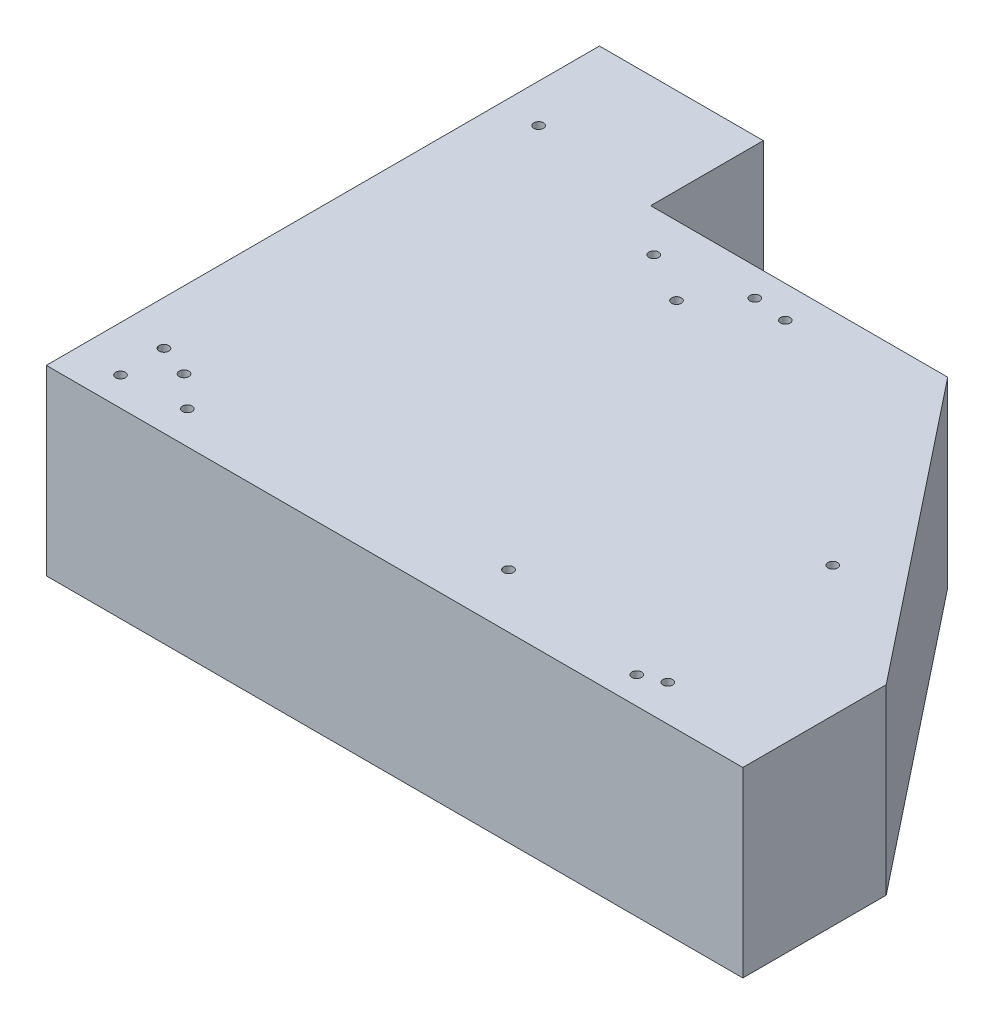
ISO-10303-21;
HEADER;
FILE_DESCRIPTION(('STEP AP214'),'2;1');
FILE_NAME('part.step','',(''),(''),'','','');
FILE_SCHEMA(('AUTOMOTIVE_DESIGN { 1 0 10303 214 1 1 1 1 }'));
ENDSEC;
DATA;
#1=APPLICATION_CONTEXT('core data for automotive mechanical design processes');
#2=APPLICATION_PROTOCOL_DEFINITION('international standard','automotive_design',2000,#1);
#3=PRODUCT_CONTEXT('',#1,'mechanical');
#4=PRODUCT('Part','Part','',(#3));
#5=PRODUCT_RELATED_PRODUCT_CATEGORY('part','',(#4));
#6=PRODUCT_DEFINITION_FORMATION('','',#4);
#7=PRODUCT_DEFINITION_CONTEXT('part definition',#1,'design');
#8=PRODUCT_DEFINITION('design','',#6,#7);
#9=PRODUCT_DEFINITION_SHAPE('','',#8);
#10=(LENGTH_UNIT() NAMED_UNIT(*) SI_UNIT(.MILLI.,.METRE.));
#11=(NAMED_UNIT(*) PLANE_ANGLE_UNIT() SI_UNIT($,.RADIAN.));
#12=(NAMED_UNIT(*) SI_UNIT($,.STERADIAN.) SOLID_ANGLE_UNIT());
#13=UNCERTAINTY_MEASURE_WITH_UNIT(LENGTH_MEASURE(1.E-05),#10,'distance_accuracy_value','');
#14=(GEOMETRIC_REPRESENTATION_CONTEXT(3) GLOBAL_UNCERTAINTY_ASSIGNED_CONTEXT((#13)) GLOBAL_UNIT_ASSIGNED_CONTEXT((#10,
#11,#12)) REPRESENTATION_CONTEXT('',''));
#15=CARTESIAN_POINT('',(0.,0.,0.));
#16=DIRECTION('',(0.,0.,1.));
#17=DIRECTION('',(1.,0.,0.));
#18=AXIS2_PLACEMENT_3D('',#15,#16,#17);
#19=CARTESIAN_POINT('',(244.3,113.03,135.64242453302));
#20=DIRECTION('',(-1.,0.,0.));
#21=DIRECTION('',(0.,0.,1.));
#22=AXIS2_PLACEMENT_3D('',#19,#20,#21);
#23=PLANE('',#22);
#24=DIRECTION('',(0.,0.,-1.));
#25=VECTOR('',#24,1.);
#26=CARTESIAN_POINT('',(244.3,0.,135.64242453302));
#27=LINE('',#26,#25);
#28=CARTESIAN_POINT('',(244.3,0.,135.64242453302));
#29=VERTEX_POINT('',#28);
#30=CARTESIAN_POINT('',(244.3,0.,46.7424245330204));
#31=VERTEX_POINT('',#30);
#32=EDGE_CURVE('E123',#29,#31,#27,.T.);
#33=ORIENTED_EDGE('',*,*,#32,.T.);
#34=DIRECTION('',(0.,-1.,0.));
#35=VECTOR('',#34,1.);
#36=CARTESIAN_POINT('',(244.3,113.03,46.7424245330204));
#37=LINE('',#36,#35);
#38=CARTESIAN_POINT('',(244.3,113.03,46.7424245330204));
#39=VERTEX_POINT('',#38);
#40=EDGE_CURVE('E11',#39,#31,#37,.T.);
#41=ORIENTED_EDGE('',*,*,#40,.F.);
#42=DIRECTION('',(0.,0.,-1.));
#43=VECTOR('',#42,1.);
#44=CARTESIAN_POINT('',(244.3,113.03,135.64242453302));
#45=LINE('',#44,#43);
#46=CARTESIAN_POINT('',(244.3,113.03,135.64242453302));
#47=VERTEX_POINT('',#46);
#48=EDGE_CURVE('E136',#47,#39,#45,.T.);
#49=ORIENTED_EDGE('',*,*,#48,.F.);
#50=DIRECTION('',(0.,-1.,0.));
#51=VECTOR('',#50,1.);
#52=CARTESIAN_POINT('',(244.3,113.03,135.64242453302));
#53=LINE('',#52,#51);
#54=EDGE_CURVE('E119',#47,#29,#53,.T.);
#55=ORIENTED_EDGE('',*,*,#54,.T.);
#56=EDGE_LOOP('',(#33,#41,#49,#55));
#57=FACE_BOUND('',#56,.T.);
#58=ADVANCED_FACE('F33',(#57),#23,.F.);
#59=CARTESIAN_POINT('',(98.25,113.03,-137.40757546698));
#60=DIRECTION('',(-0.783497679089534,0.,0.621394711002044));
#61=DIRECTION('',(0.621394711002044,0.,0.783497679089534));
#62=AXIS2_PLACEMENT_3D('',#59,#60,#61);
#63=PLANE('',#62);
#64=DIRECTION('',(-0.621394711002044,0.,-0.783497679089534));
#65=VECTOR('',#64,1.);
#66=CARTESIAN_POINT('',(98.25,0.,-137.40757546698));
#67=LINE('',#66,#65);
#68=CARTESIAN_POINT('',(98.25,0.,-137.40757546698));
#69=VERTEX_POINT('',#68);
#70=EDGE_CURVE('E126',#31,#69,#67,.T.);
#71=ORIENTED_EDGE('',*,*,#70,.T.);
#72=DIRECTION('',(0.,-1.,0.));
#73=VECTOR('',#72,1.);
#74=CARTESIAN_POINT('',(98.25,113.03,-137.40757546698));
#75=LINE('',#74,#73);
#76=CARTESIAN_POINT('',(98.25,113.03,-137.40757546698));
#77=VERTEX_POINT('',#76);
#78=EDGE_CURVE('E41',#77,#69,#75,.T.);
#79=ORIENTED_EDGE('',*,*,#78,.F.);
#80=DIRECTION('',(-0.621394711002044,0.,-0.783497679089534));
#81=VECTOR('',#80,1.);
#82=CARTESIAN_POINT('',(98.25,113.03,-137.40757546698));
#83=LINE('',#82,#81);
#84=EDGE_CURVE('E89',#39,#77,#83,.T.);
#85=ORIENTED_EDGE('',*,*,#84,.F.);
#86=ORIENTED_EDGE('',*,*,#40,.T.);
#87=EDGE_LOOP('',(#71,#79,#85,#86));
#88=FACE_BOUND('',#87,.T.);
#89=ADVANCED_FACE('F290',(#88),#63,.F.);
#90=CARTESIAN_POINT('',(-85.9,113.03,-137.40757546698));
#91=DIRECTION('',(0.,0.,1.));
#92=DIRECTION('',(1.,0.,0.));
#93=AXIS2_PLACEMENT_3D('',#90,#91,#92);
#94=PLANE('',#93);
#95=DIRECTION('',(-1.,0.,0.));
#96=VECTOR('',#95,1.);
#97=CARTESIAN_POINT('',(-85.9,0.,-137.40757546698));
#98=LINE('',#97,#96);
#99=CARTESIAN_POINT('',(-85.9,0.,-137.40757546698));
#100=VERTEX_POINT('',#99);
#101=EDGE_CURVE('E129',#69,#100,#98,.T.);
#102=ORIENTED_EDGE('',*,*,#101,.T.);
#103=DIRECTION('',(0.,-1.,0.));
#104=VECTOR('',#103,1.);
#105=CARTESIAN_POINT('',(-85.9,113.03,-137.40757546698));
#106=LINE('',#105,#104);
#107=CARTESIAN_POINT('',(-85.9,113.03,-137.40757546698));
#108=VERTEX_POINT('',#107);
#109=EDGE_CURVE('E140',#108,#100,#106,.T.);
#110=ORIENTED_EDGE('',*,*,#109,.F.);
#111=DIRECTION('',(-1.,0.,0.));
#112=VECTOR('',#111,1.);
#113=CARTESIAN_POINT('',(-85.9,113.03,-137.40757546698));
#114=LINE('',#113,#112);
#115=EDGE_CURVE('E148',#77,#108,#114,.T.);
#116=ORIENTED_EDGE('',*,*,#115,.F.);
#117=ORIENTED_EDGE('',*,*,#78,.T.);
#118=EDGE_LOOP('',(#102,#110,#116,#117));
#119=FACE_BOUND('',#118,.T.);
#120=ADVANCED_FACE('F146',(#119),#94,.F.);
#121=CARTESIAN_POINT('',(-85.9,113.03,-207.25757546698));
#122=DIRECTION('',(-1.,0.,0.));
#123=DIRECTION('',(0.,0.,1.));
#124=AXIS2_PLACEMENT_3D('',#121,#122,#123);
#125=PLANE('',#124);
#126=DIRECTION('',(0.,0.,-1.));
#127=VECTOR('',#126,1.);
#128=CARTESIAN_POINT('',(-85.9,0.,-207.25757546698));
#129=LINE('',#128,#127);
#130=CARTESIAN_POINT('',(-85.9,0.,-207.25757546698));
#131=VERTEX_POINT('',#130);
#132=EDGE_CURVE('E131',#100,#131,#129,.T.);
#133=ORIENTED_EDGE('',*,*,#132,.T.);
#134=DIRECTION('',(0.,-1.,0.));
#135=VECTOR('',#134,1.);
#136=CARTESIAN_POINT('',(-85.9,113.03,-207.25757546698));
#137=LINE('',#136,#135);
#138=CARTESIAN_POINT('',(-85.9,113.03,-207.25757546698));
#139=VERTEX_POINT('',#138);
#140=EDGE_CURVE('E114',#139,#131,#137,.T.);
#141=ORIENTED_EDGE('',*,*,#140,.F.);
#142=DIRECTION('',(0.,0.,-1.));
#143=VECTOR('',#142,1.);
#144=CARTESIAN_POINT('',(-85.9,113.03,-207.25757546698));
#145=LINE('',#144,#143);
#146=EDGE_CURVE('E105',#108,#139,#145,.T.);
#147=ORIENTED_EDGE('',*,*,#146,.F.);
#148=ORIENTED_EDGE('',*,*,#109,.T.);
#149=EDGE_LOOP('',(#133,#141,#147,#148));
#150=FACE_BOUND('',#149,.T.);
#151=ADVANCED_FACE('F154',(#150),#125,.F.);
#152=CARTESIAN_POINT('',(-187.5,113.03,-207.25757546698));
#153=DIRECTION('',(0.,0.,1.));
#154=DIRECTION('',(1.,0.,0.));
#155=AXIS2_PLACEMENT_3D('',#152,#153,#154);
#156=PLANE('',#155);
#157=DIRECTION('',(-1.,0.,0.));
#158=VECTOR('',#157,1.);
#159=CARTESIAN_POINT('',(-187.5,0.,-207.25757546698));
#160=LINE('',#159,#158);
#161=CARTESIAN_POINT('',(-187.5,0.,-207.25757546698));
#162=VERTEX_POINT('',#161);
#163=EDGE_CURVE('E113',#131,#162,#160,.T.);
#164=ORIENTED_EDGE('',*,*,#163,.T.);
#165=DIRECTION('',(0.,-1.,0.));
#166=VECTOR('',#165,1.);
#167=CARTESIAN_POINT('',(-187.5,113.03,-207.25757546698));
#168=LINE('',#167,#166);
#169=CARTESIAN_POINT('',(-187.5,113.03,-207.25757546698));
#170=VERTEX_POINT('',#169);
#171=EDGE_CURVE('E110',#170,#162,#168,.T.);
#172=ORIENTED_EDGE('',*,*,#171,.F.);
#173=DIRECTION('',(-1.,0.,0.));
#174=VECTOR('',#173,1.);
#175=CARTESIAN_POINT('',(-187.5,113.03,-207.25757546698));
#176=LINE('',#175,#174);
#177=EDGE_CURVE('E99',#139,#170,#176,.T.);
#178=ORIENTED_EDGE('',*,*,#177,.F.);
#179=ORIENTED_EDGE('',*,*,#140,.T.);
#180=EDGE_LOOP('',(#164,#172,#178,#179));
#181=FACE_BOUND('',#180,.T.);
#182=ADVANCED_FACE('F111',(#181),#156,.F.);
#183=CARTESIAN_POINT('',(-187.5,113.03,135.64242453302));
#184=DIRECTION('',(1.,0.,0.));
#185=DIRECTION('',(0.,0.,-1.));
#186=AXIS2_PLACEMENT_3D('',#183,#184,#185);
#187=PLANE('',#186);
#188=DIRECTION('',(0.,0.,1.));
#189=VECTOR('',#188,1.);
#190=CARTESIAN_POINT('',(-187.5,0.,135.64242453302));
#191=LINE('',#190,#189);
#192=CARTESIAN_POINT('',(-187.5,0.,135.64242453302));
#193=VERTEX_POINT('',#192);
#194=EDGE_CURVE('E75',#162,#193,#191,.T.);
#195=ORIENTED_EDGE('',*,*,#194,.T.);
#196=DIRECTION('',(0.,-1.,0.));
#197=VECTOR('',#196,1.);
#198=CARTESIAN_POINT('',(-187.5,113.03,135.64242453302));
#199=LINE('',#198,#197);
#200=CARTESIAN_POINT('',(-187.5,113.03,135.64242453302));
#201=VERTEX_POINT('',#200);
#202=EDGE_CURVE('E115',#201,#193,#199,.T.);
#203=ORIENTED_EDGE('',*,*,#202,.F.);
#204=DIRECTION('',(0.,0.,1.));
#205=VECTOR('',#204,1.);
#206=CARTESIAN_POINT('',(-187.5,113.03,135.64242453302));
#207=LINE('',#206,#205);
#208=EDGE_CURVE('E103',#170,#201,#207,.T.);
#209=ORIENTED_EDGE('',*,*,#208,.F.);
#210=ORIENTED_EDGE('',*,*,#171,.T.);
#211=EDGE_LOOP('',(#195,#203,#209,#210));
#212=FACE_BOUND('',#211,.T.);
#213=ADVANCED_FACE('F117',(#212),#187,.F.);
#214=CARTESIAN_POINT('',(-187.5,113.03,135.64242453302));
#215=DIRECTION('',(0.,0.,-1.));
#216=DIRECTION('',(-1.,0.,0.));
#217=AXIS2_PLACEMENT_3D('',#214,#215,#216);
#218=PLANE('',#217);
#219=DIRECTION('',(1.,0.,0.));
#220=VECTOR('',#219,1.);
#221=CARTESIAN_POINT('',(-187.5,0.,135.64242453302));
#222=LINE('',#221,#220);
#223=EDGE_CURVE('E81',#193,#29,#222,.T.);
#224=ORIENTED_EDGE('',*,*,#223,.T.);
#225=ORIENTED_EDGE('',*,*,#54,.F.);
#226=DIRECTION('',(1.,0.,0.));
#227=VECTOR('',#226,1.);
#228=CARTESIAN_POINT('',(-187.5,113.03,135.64242453302));
#229=LINE('',#228,#227);
#230=EDGE_CURVE('E49',#201,#47,#229,.T.);
#231=ORIENTED_EDGE('',*,*,#230,.F.);
#232=ORIENTED_EDGE('',*,*,#202,.T.);
#233=EDGE_LOOP('',(#224,#225,#231,#232));
#234=FACE_BOUND('',#233,.T.);
#235=ADVANCED_FACE('F248',(#234),#218,.F.);
#236=CARTESIAN_POINT('',(0.,113.03,0.));
#237=DIRECTION('',(0.,-1.,0.));
#238=DIRECTION('',(0.,0.,-1.));
#239=AXIS2_PLACEMENT_3D('',#236,#237,#238);
#240=PLANE('',#239);
#241=CARTESIAN_POINT('',(-163.609115423291,113.03,-145.69581866178));
#242=DIRECTION('',(0.,1.,0.));
#243=DIRECTION('',(0.,0.,1.));
#244=AXIS2_PLACEMENT_3D('',#241,#242,#243);
#245=CIRCLE('',#244,2.99999999999999);
#246=CARTESIAN_POINT('',(-163.609115423291,113.03,-142.69581866178));
#247=VERTEX_POINT('',#246);
#248=EDGE_CURVE('E184',#247,#247,#245,.T.);
#249=ORIENTED_EDGE('',*,*,#248,.F.);
#250=EDGE_LOOP('',(#249));
#251=FACE_BOUND('',#250,.T.);
#252=CARTESIAN_POINT('',(-26.9080892444064,113.03,-94.4471216475152));
#253=DIRECTION('',(0.,1.,0.));
#254=DIRECTION('',(0.,0.,1.));
#255=AXIS2_PLACEMENT_3D('',#252,#253,#254);
#256=CIRCLE('',#255,3.);
#257=CARTESIAN_POINT('',(-26.9080892444064,113.03,-91.4471216475152));
#258=VERTEX_POINT('',#257);
#259=EDGE_CURVE('E212',#258,#258,#256,.T.);
#260=ORIENTED_EDGE('',*,*,#259,.F.);
#261=EDGE_LOOP('',(#260));
#262=FACE_BOUND('',#261,.T.);
#263=CARTESIAN_POINT('',(17.3942437173283,113.03,-117.62692523054));
#264=DIRECTION('',(0.,1.,0.));
#265=DIRECTION('',(0.,0.,1.));
#266=AXIS2_PLACEMENT_3D('',#263,#264,#265);
#267=CIRCLE('',#266,3.);
#268=CARTESIAN_POINT('',(17.3942437173283,113.03,-114.62692523054));
#269=VERTEX_POINT('',#268);
#270=EDGE_CURVE('E218',#269,#269,#267,.T.);
#271=ORIENTED_EDGE('',*,*,#270,.F.);
#272=EDGE_LOOP('',(#271));
#273=FACE_BOUND('',#272,.T.);
#274=CARTESIAN_POINT('',(-140.251816154117,113.03,97.5172076080881));
#275=DIRECTION('',(0.,1.,0.));
#276=DIRECTION('',(0.,0.,1.));
#277=AXIS2_PLACEMENT_3D('',#274,#275,#276);
#278=CIRCLE('',#277,3.000000000002);
#279=CARTESIAN_POINT('',(-140.251816154117,113.03,100.51720760809));
#280=VERTEX_POINT('',#279);
#281=EDGE_CURVE('E224',#280,#280,#278,.T.);
#282=ORIENTED_EDGE('',*,*,#281,.F.);
#283=EDGE_LOOP('',(#282));
#284=FACE_BOUND('',#283,.T.);
#285=CARTESIAN_POINT('',(161.606684995097,113.03,118.729685561835));
#286=DIRECTION('',(0.,1.,0.));
#287=DIRECTION('',(0.,0.,1.));
#288=AXIS2_PLACEMENT_3D('',#285,#286,#287);
#289=CIRCLE('',#288,2.99999999999999);
#290=CARTESIAN_POINT('',(161.606684995097,113.03,121.729685561835));
#291=VERTEX_POINT('',#290);
#292=EDGE_CURVE('E189',#291,#291,#289,.T.);
#293=ORIENTED_EDGE('',*,*,#292,.F.);
#294=EDGE_LOOP('',(#293));
#295=FACE_BOUND('',#294,.T.);
#296=CARTESIAN_POINT('',(-3.89888254508934,113.03,-120.015251172101));
#297=DIRECTION('',(0.,1.,0.));
#298=DIRECTION('',(0.,0.,1.));
#299=AXIS2_PLACEMENT_3D('',#296,#297,#298);
#300=CIRCLE('',#299,3.);
#301=CARTESIAN_POINT('',(-3.89888254508934,113.03,-117.015251172101));
#302=VERTEX_POINT('',#301);
#303=EDGE_CURVE('E181',#302,#302,#300,.T.);
#304=ORIENTED_EDGE('',*,*,#303,.F.);
#305=EDGE_LOOP('',(#304));
#306=FACE_BOUND('',#305,.T.);
#307=CARTESIAN_POINT('',(175.311223126512,113.03,113.14956955285));
#308=DIRECTION('',(0.,1.,0.));
#309=DIRECTION('',(0.,0.,1.));
#310=AXIS2_PLACEMENT_3D('',#307,#308,#309);
#311=CIRCLE('',#310,3.000000000002);
#312=CARTESIAN_POINT('',(175.311223126512,113.03,116.149569552852));
#313=VERTEX_POINT('',#312);
#314=EDGE_CURVE('E175',#313,#313,#311,.T.);
#315=ORIENTED_EDGE('',*,*,#314,.F.);
#316=EDGE_LOOP('',(#315));
#317=FACE_BOUND('',#316,.T.);
#318=CARTESIAN_POINT('',(-160.1588842702,113.03,90.0363963788493));
#319=DIRECTION('',(0.,1.,0.));
#320=DIRECTION('',(0.,0.,1.));
#321=AXIS2_PLACEMENT_3D('',#318,#319,#320);
#322=CIRCLE('',#321,2.99999999999999);
#323=CARTESIAN_POINT('',(-160.1588842702,113.03,93.0363963788493));
#324=VERTEX_POINT('',#323);
#325=EDGE_CURVE('E169',#324,#324,#322,.T.);
#326=ORIENTED_EDGE('',*,*,#325,.F.);
#327=EDGE_LOOP('',(#326));
#328=FACE_BOUND('',#327,.T.);
#329=CARTESIAN_POINT('',(-159.322465717758,113.03,117.822298668571));
#330=DIRECTION('',(0.,1.,0.));
#331=DIRECTION('',(0.,0.,1.));
#332=AXIS2_PLACEMENT_3D('',#329,#330,#331);
#333=CIRCLE('',#332,2.99999999999999);
#334=CARTESIAN_POINT('',(-159.322465717758,113.03,120.822298668571));
#335=VERTEX_POINT('',#334);
#336=EDGE_CURVE('E162',#335,#335,#333,.T.);
#337=ORIENTED_EDGE('',*,*,#336,.F.);
#338=EDGE_LOOP('',(#337));
#339=FACE_BOUND('',#338,.T.);
#340=CARTESIAN_POINT('',(-120.450372331489,113.03,115.251672549041));
#341=DIRECTION('',(0.,1.,0.));
#342=DIRECTION('',(0.,0.,1.));
#343=AXIS2_PLACEMENT_3D('',#340,#341,#342);
#344=CIRCLE('',#343,3.00000000000001);
#345=CARTESIAN_POINT('',(-120.450372331489,113.03,118.251672549041));
#346=VERTEX_POINT('',#345);
#347=EDGE_CURVE('E163',#346,#346,#344,.T.);
#348=ORIENTED_EDGE('',*,*,#347,.F.);
#349=EDGE_LOOP('',(#348));
#350=FACE_BOUND('',#349,.T.);
#351=CARTESIAN_POINT('',(-58.5449624334448,113.03,-112.036813195635));
#352=DIRECTION('',(0.,1.,0.));
#353=DIRECTION('',(0.,0.,1.));
#354=AXIS2_PLACEMENT_3D('',#351,#352,#353);
#355=CIRCLE('',#354,3.000000000002);
#356=CARTESIAN_POINT('',(-58.5449624334448,113.03,-109.036813195633));
#357=VERTEX_POINT('',#356);
#358=EDGE_CURVE('E201',#357,#357,#355,.T.);
#359=ORIENTED_EDGE('',*,*,#358,.F.);
#360=EDGE_LOOP('',(#359));
#361=FACE_BOUND('',#360,.T.);
#362=CARTESIAN_POINT('',(65.4788113688982,113.03,102.100885869824));
#363=DIRECTION('',(0.,1.,0.));
#364=DIRECTION('',(0.,0.,1.));
#365=AXIS2_PLACEMENT_3D('',#362,#363,#364);
#366=CIRCLE('',#365,2.99999999999999);
#367=CARTESIAN_POINT('',(65.4788113688982,113.03,105.100885869824));
#368=VERTEX_POINT('',#367);
#369=EDGE_CURVE('E195',#368,#368,#366,.T.);
#370=ORIENTED_EDGE('',*,*,#369,.F.);
#371=EDGE_LOOP('',(#370));
#372=FACE_BOUND('',#371,.T.);
#373=CARTESIAN_POINT('',(163.603739252658,113.03,-0.788099456570386));
#374=DIRECTION('',(0.,1.,0.));
#375=DIRECTION('',(0.,0.,1.));
#376=AXIS2_PLACEMENT_3D('',#373,#374,#375);
#377=CIRCLE('',#376,2.99999999999999);
#378=CARTESIAN_POINT('',(163.603739252658,113.03,2.21190054342961));
#379=VERTEX_POINT('',#378);
#380=EDGE_CURVE('E188',#379,#379,#377,.T.);
#381=ORIENTED_EDGE('',*,*,#380,.F.);
#382=EDGE_LOOP('',(#381));
#383=FACE_BOUND('',#382,.T.);
#384=ORIENTED_EDGE('',*,*,#48,.T.);
#385=ORIENTED_EDGE('',*,*,#84,.T.);
#386=ORIENTED_EDGE('',*,*,#115,.T.);
#387=ORIENTED_EDGE('',*,*,#146,.T.);
#388=ORIENTED_EDGE('',*,*,#177,.T.);
#389=ORIENTED_EDGE('',*,*,#208,.T.);
#390=ORIENTED_EDGE('',*,*,#230,.T.);
#391=EDGE_LOOP('',(#384,#385,#386,#387,#388,#389,#390));
#392=FACE_BOUND('',#391,.T.);
#393=ADVANCED_FACE('F101',(#251,#262,#273,#284,#295,#306,#317,#328,#339,#350,#361,#372,#383,
#392),#240,.F.);
#394=CARTESIAN_POINT('',(0.,0.,0.));
#395=DIRECTION('',(0.,-1.,0.));
#396=DIRECTION('',(0.,0.,-1.));
#397=AXIS2_PLACEMENT_3D('',#394,#395,#396);
#398=PLANE('',#397);
#399=ORIENTED_EDGE('',*,*,#32,.F.);
#400=ORIENTED_EDGE('',*,*,#223,.F.);
#401=ORIENTED_EDGE('',*,*,#194,.F.);
#402=ORIENTED_EDGE('',*,*,#163,.F.);
#403=ORIENTED_EDGE('',*,*,#132,.F.);
#404=ORIENTED_EDGE('',*,*,#101,.F.);
#405=ORIENTED_EDGE('',*,*,#70,.F.);
#406=EDGE_LOOP('',(#399,#400,#401,#402,#403,#404,#405));
#407=FACE_BOUND('',#406,.T.);
#408=ADVANCED_FACE('F152',(#407),#398,.T.);
#409=CARTESIAN_POINT('',(163.603739252658,93.03,-0.788099456570386));
#410=DIRECTION('',(0.,1.,0.));
#411=DIRECTION('',(0.,0.,1.));
#412=AXIS2_PLACEMENT_3D('',#409,#410,#411);
#413=CYLINDRICAL_SURFACE('',#412,2.99999999999999);
#414=CARTESIAN_POINT('',(163.603739252658,93.03,-0.788099456570386));
#415=DIRECTION('',(0.,1.,0.));
#416=DIRECTION('',(0.,0.,1.));
#417=AXIS2_PLACEMENT_3D('',#414,#415,#416);
#418=CIRCLE('',#417,2.99999999999999);
#419=CARTESIAN_POINT('',(163.603739252658,93.03,2.21190054342961));
#420=VERTEX_POINT('',#419);
#421=EDGE_CURVE('E185',#420,#420,#418,.T.);
#422=ORIENTED_EDGE('',*,*,#421,.F.);
#423=EDGE_LOOP('',(#422));
#424=FACE_BOUND('',#423,.T.);
#425=ORIENTED_EDGE('',*,*,#380,.T.);
#426=EDGE_LOOP('',(#425));
#427=FACE_BOUND('',#426,.T.);
#428=ADVANCED_FACE('F274',(#424,#427),#413,.F.);
#429=CARTESIAN_POINT('',(163.603739252658,93.03,-0.788099456570386));
#430=DIRECTION('',(0.,1.,0.));
#431=DIRECTION('',(0.,0.,1.));
#432=AXIS2_PLACEMENT_3D('',#429,#430,#431);
#433=PLANE('',#432);
#434=ORIENTED_EDGE('',*,*,#421,.T.);
#435=EDGE_LOOP('',(#434));
#436=FACE_BOUND('',#435,.T.);
#437=ADVANCED_FACE('F276',(#436),#433,.T.);
#438=CARTESIAN_POINT('',(65.4788113688982,93.03,102.100885869824));
#439=DIRECTION('',(0.,1.,0.));
#440=DIRECTION('',(0.,0.,1.));
#441=AXIS2_PLACEMENT_3D('',#438,#439,#440);
#442=CYLINDRICAL_SURFACE('',#441,2.99999999999999);
#443=CARTESIAN_POINT('',(65.4788113688982,93.03,102.100885869824));
#444=DIRECTION('',(0.,1.,0.));
#445=DIRECTION('',(0.,0.,1.));
#446=AXIS2_PLACEMENT_3D('',#443,#444,#445);
#447=CIRCLE('',#446,2.99999999999999);
#448=CARTESIAN_POINT('',(65.4788113688982,93.03,105.100885869824));
#449=VERTEX_POINT('',#448);
#450=EDGE_CURVE('E192',#449,#449,#447,.T.);
#451=ORIENTED_EDGE('',*,*,#450,.F.);
#452=EDGE_LOOP('',(#451));
#453=FACE_BOUND('',#452,.T.);
#454=ORIENTED_EDGE('',*,*,#369,.T.);
#455=EDGE_LOOP('',(#454));
#456=FACE_BOUND('',#455,.T.);
#457=ADVANCED_FACE('F283',(#453,#456),#442,.F.);
#458=CARTESIAN_POINT('',(65.4788113688982,93.03,102.100885869824));
#459=DIRECTION('',(0.,1.,0.));
#460=DIRECTION('',(0.,0.,1.));
#461=AXIS2_PLACEMENT_3D('',#458,#459,#460);
#462=PLANE('',#461);
#463=ORIENTED_EDGE('',*,*,#450,.T.);
#464=EDGE_LOOP('',(#463));
#465=FACE_BOUND('',#464,.T.);
#466=ADVANCED_FACE('F360',(#465),#462,.T.);
#467=CARTESIAN_POINT('',(-58.5449624334448,93.03,-112.036813195635));
#468=DIRECTION('',(0.,1.,0.));
#469=DIRECTION('',(0.,0.,1.));
#470=AXIS2_PLACEMENT_3D('',#467,#468,#469);
#471=CYLINDRICAL_SURFACE('',#470,3.000000000002);
#472=CARTESIAN_POINT('',(-58.5449624334448,93.03,-112.036813195635));
#473=DIRECTION('',(0.,1.,0.));
#474=DIRECTION('',(0.,0.,1.));
#475=AXIS2_PLACEMENT_3D('',#472,#473,#474);
#476=CIRCLE('',#475,3.000000000002);
#477=CARTESIAN_POINT('',(-58.5449624334448,93.03,-109.036813195633));
#478=VERTEX_POINT('',#477);
#479=EDGE_CURVE('E198',#478,#478,#476,.T.);
#480=ORIENTED_EDGE('',*,*,#479,.F.);
#481=EDGE_LOOP('',(#480));
#482=FACE_BOUND('',#481,.T.);
#483=ORIENTED_EDGE('',*,*,#358,.T.);
#484=EDGE_LOOP('',(#483));
#485=FACE_BOUND('',#484,.T.);
#486=ADVANCED_FACE('F370',(#482,#485),#471,.F.);
#487=CARTESIAN_POINT('',(-58.5449624334448,93.03,-112.036813195635));
#488=DIRECTION('',(0.,1.,0.));
#489=DIRECTION('',(0.,0.,1.));
#490=AXIS2_PLACEMENT_3D('',#487,#488,#489);
#491=PLANE('',#490);
#492=ORIENTED_EDGE('',*,*,#479,.T.);
#493=EDGE_LOOP('',(#492));
#494=FACE_BOUND('',#493,.T.);
#495=ADVANCED_FACE('F379',(#494),#491,.T.);
#496=CARTESIAN_POINT('',(-120.450372331489,93.03,115.251672549041));
#497=DIRECTION('',(0.,1.,0.));
#498=DIRECTION('',(0.,0.,1.));
#499=AXIS2_PLACEMENT_3D('',#496,#497,#498);
#500=CYLINDRICAL_SURFACE('',#499,3.00000000000001);
#501=CARTESIAN_POINT('',(-120.450372331489,93.03,115.251672549041));
#502=DIRECTION('',(0.,1.,0.));
#503=DIRECTION('',(0.,0.,1.));
#504=AXIS2_PLACEMENT_3D('',#501,#502,#503);
#505=CIRCLE('',#504,3.00000000000001);
#506=CARTESIAN_POINT('',(-120.450372331489,93.03,118.251672549041));
#507=VERTEX_POINT('',#506);
#508=EDGE_CURVE('E204',#507,#507,#505,.T.);
#509=ORIENTED_EDGE('',*,*,#508,.F.);
#510=EDGE_LOOP('',(#509));
#511=FACE_BOUND('',#510,.T.);
#512=ORIENTED_EDGE('',*,*,#347,.T.);
#513=EDGE_LOOP('',(#512));
#514=FACE_BOUND('',#513,.T.);
#515=ADVANCED_FACE('F389',(#511,#514),#500,.F.);
#516=CARTESIAN_POINT('',(-120.450372331489,93.03,115.251672549041));
#517=DIRECTION('',(0.,1.,0.));
#518=DIRECTION('',(0.,0.,1.));
#519=AXIS2_PLACEMENT_3D('',#516,#517,#518);
#520=PLANE('',#519);
#521=ORIENTED_EDGE('',*,*,#508,.T.);
#522=EDGE_LOOP('',(#521));
#523=FACE_BOUND('',#522,.T.);
#524=ADVANCED_FACE('F399',(#523),#520,.T.);
#525=CARTESIAN_POINT('',(-159.322465717758,93.03,117.822298668571));
#526=DIRECTION('',(0.,1.,0.));
#527=DIRECTION('',(0.,0.,1.));
#528=AXIS2_PLACEMENT_3D('',#525,#526,#527);
#529=CYLINDRICAL_SURFACE('',#528,2.99999999999999);
#530=CARTESIAN_POINT('',(-159.322465717758,93.03,117.822298668571));
#531=DIRECTION('',(0.,1.,0.));
#532=DIRECTION('',(0.,0.,1.));
#533=AXIS2_PLACEMENT_3D('',#530,#531,#532);
#534=CIRCLE('',#533,2.99999999999999);
#535=CARTESIAN_POINT('',(-159.322465717758,93.03,120.822298668571));
#536=VERTEX_POINT('',#535);
#537=EDGE_CURVE('E159',#536,#536,#534,.T.);
#538=ORIENTED_EDGE('',*,*,#537,.F.);
#539=EDGE_LOOP('',(#538));
#540=FACE_BOUND('',#539,.T.);
#541=ORIENTED_EDGE('',*,*,#336,.T.);
#542=EDGE_LOOP('',(#541));
#543=FACE_BOUND('',#542,.T.);
#544=ADVANCED_FACE('F409',(#540,#543),#529,.F.);
#545=CARTESIAN_POINT('',(-159.322465717758,93.03,117.822298668571));
#546=DIRECTION('',(0.,1.,0.));
#547=DIRECTION('',(0.,0.,1.));
#548=AXIS2_PLACEMENT_3D('',#545,#546,#547);
#549=PLANE('',#548);
#550=ORIENTED_EDGE('',*,*,#537,.T.);
#551=EDGE_LOOP('',(#550));
#552=FACE_BOUND('',#551,.T.);
#553=ADVANCED_FACE('F419',(#552),#549,.T.);
#554=CARTESIAN_POINT('',(-160.1588842702,93.03,90.0363963788493));
#555=DIRECTION('',(0.,1.,0.));
#556=DIRECTION('',(0.,0.,1.));
#557=AXIS2_PLACEMENT_3D('',#554,#555,#556);
#558=CYLINDRICAL_SURFACE('',#557,2.99999999999999);
#559=CARTESIAN_POINT('',(-160.1588842702,93.03,90.0363963788493));
#560=DIRECTION('',(0.,1.,0.));
#561=DIRECTION('',(0.,0.,1.));
#562=AXIS2_PLACEMENT_3D('',#559,#560,#561);
#563=CIRCLE('',#562,2.99999999999999);
#564=CARTESIAN_POINT('',(-160.1588842702,93.03,93.0363963788493));
#565=VERTEX_POINT('',#564);
#566=EDGE_CURVE('E166',#565,#565,#563,.T.);
#567=ORIENTED_EDGE('',*,*,#566,.F.);
#568=EDGE_LOOP('',(#567));
#569=FACE_BOUND('',#568,.T.);
#570=ORIENTED_EDGE('',*,*,#325,.T.);
#571=EDGE_LOOP('',(#570));
#572=FACE_BOUND('',#571,.T.);
#573=ADVANCED_FACE('F429',(#569,#572),#558,.F.);
#574=CARTESIAN_POINT('',(-160.1588842702,93.03,90.0363963788493));
#575=DIRECTION('',(0.,1.,0.));
#576=DIRECTION('',(0.,0.,1.));
#577=AXIS2_PLACEMENT_3D('',#574,#575,#576);
#578=PLANE('',#577);
#579=ORIENTED_EDGE('',*,*,#566,.T.);
#580=EDGE_LOOP('',(#579));
#581=FACE_BOUND('',#580,.T.);
#582=ADVANCED_FACE('F439',(#581),#578,.T.);
#583=CARTESIAN_POINT('',(175.311223126512,93.03,113.14956955285));
#584=DIRECTION('',(0.,1.,0.));
#585=DIRECTION('',(0.,0.,1.));
#586=AXIS2_PLACEMENT_3D('',#583,#584,#585);
#587=CYLINDRICAL_SURFACE('',#586,3.000000000002);
#588=CARTESIAN_POINT('',(175.311223126512,93.03,113.14956955285));
#589=DIRECTION('',(0.,1.,0.));
#590=DIRECTION('',(0.,0.,1.));
#591=AXIS2_PLACEMENT_3D('',#588,#589,#590);
#592=CIRCLE('',#591,3.000000000002);
#593=CARTESIAN_POINT('',(175.311223126512,93.03,116.149569552852));
#594=VERTEX_POINT('',#593);
#595=EDGE_CURVE('E172',#594,#594,#592,.T.);
#596=ORIENTED_EDGE('',*,*,#595,.F.);
#597=EDGE_LOOP('',(#596));
#598=FACE_BOUND('',#597,.T.);
#599=ORIENTED_EDGE('',*,*,#314,.T.);
#600=EDGE_LOOP('',(#599));
#601=FACE_BOUND('',#600,.T.);
#602=ADVANCED_FACE('F449',(#598,#601),#587,.F.);
#603=CARTESIAN_POINT('',(175.311223126512,93.03,113.14956955285));
#604=DIRECTION('',(0.,1.,0.));
#605=DIRECTION('',(0.,0.,1.));
#606=AXIS2_PLACEMENT_3D('',#603,#604,#605);
#607=PLANE('',#606);
#608=ORIENTED_EDGE('',*,*,#595,.T.);
#609=EDGE_LOOP('',(#608));
#610=FACE_BOUND('',#609,.T.);
#611=ADVANCED_FACE('F459',(#610),#607,.T.);
#612=CARTESIAN_POINT('',(-3.89888254508934,93.03,-120.015251172101));
#613=DIRECTION('',(0.,1.,0.));
#614=DIRECTION('',(0.,0.,1.));
#615=AXIS2_PLACEMENT_3D('',#612,#613,#614);
#616=CYLINDRICAL_SURFACE('',#615,3.);
#617=CARTESIAN_POINT('',(-3.89888254508934,93.03,-120.015251172101));
#618=DIRECTION('',(0.,1.,0.));
#619=DIRECTION('',(0.,0.,1.));
#620=AXIS2_PLACEMENT_3D('',#617,#618,#619);
#621=CIRCLE('',#620,3.);
#622=CARTESIAN_POINT('',(-3.89888254508934,93.03,-117.015251172101));
#623=VERTEX_POINT('',#622);
#624=EDGE_CURVE('E178',#623,#623,#621,.T.);
#625=ORIENTED_EDGE('',*,*,#624,.F.);
#626=EDGE_LOOP('',(#625));
#627=FACE_BOUND('',#626,.T.);
#628=ORIENTED_EDGE('',*,*,#303,.T.);
#629=EDGE_LOOP('',(#628));
#630=FACE_BOUND('',#629,.T.);
#631=ADVANCED_FACE('F469',(#627,#630),#616,.F.);
#632=CARTESIAN_POINT('',(-3.89888254508934,93.03,-120.015251172101));
#633=DIRECTION('',(0.,1.,0.));
#634=DIRECTION('',(0.,0.,1.));
#635=AXIS2_PLACEMENT_3D('',#632,#633,#634);
#636=PLANE('',#635);
#637=ORIENTED_EDGE('',*,*,#624,.T.);
#638=EDGE_LOOP('',(#637));
#639=FACE_BOUND('',#638,.T.);
#640=ADVANCED_FACE('F479',(#639),#636,.T.);
#641=CARTESIAN_POINT('',(161.606684995097,93.03,118.729685561835));
#642=DIRECTION('',(0.,1.,0.));
#643=DIRECTION('',(0.,0.,1.));
#644=AXIS2_PLACEMENT_3D('',#641,#642,#643);
#645=CYLINDRICAL_SURFACE('',#644,2.99999999999999);
#646=CARTESIAN_POINT('',(161.606684995097,93.03,118.729685561835));
#647=DIRECTION('',(0.,1.,0.));
#648=DIRECTION('',(0.,0.,1.));
#649=AXIS2_PLACEMENT_3D('',#646,#647,#648);
#650=CIRCLE('',#649,2.99999999999999);
#651=CARTESIAN_POINT('',(161.606684995097,93.03,121.729685561835));
#652=VERTEX_POINT('',#651);
#653=EDGE_CURVE('E227',#652,#652,#650,.T.);
#654=ORIENTED_EDGE('',*,*,#653,.F.);
#655=EDGE_LOOP('',(#654));
#656=FACE_BOUND('',#655,.T.);
#657=ORIENTED_EDGE('',*,*,#292,.T.);
#658=EDGE_LOOP('',(#657));
#659=FACE_BOUND('',#658,.T.);
#660=ADVANCED_FACE('F489',(#656,#659),#645,.F.);
#661=CARTESIAN_POINT('',(161.606684995097,93.03,118.729685561835));
#662=DIRECTION('',(0.,1.,0.));
#663=DIRECTION('',(0.,0.,1.));
#664=AXIS2_PLACEMENT_3D('',#661,#662,#663);
#665=PLANE('',#664);
#666=ORIENTED_EDGE('',*,*,#653,.T.);
#667=EDGE_LOOP('',(#666));
#668=FACE_BOUND('',#667,.T.);
#669=ADVANCED_FACE('F499',(#668),#665,.T.);
#670=CARTESIAN_POINT('',(-140.251816154117,93.03,97.5172076080881));
#671=DIRECTION('',(0.,1.,0.));
#672=DIRECTION('',(0.,0.,1.));
#673=AXIS2_PLACEMENT_3D('',#670,#671,#672);
#674=CYLINDRICAL_SURFACE('',#673,3.000000000002);
#675=CARTESIAN_POINT('',(-140.251816154117,93.03,97.5172076080881));
#676=DIRECTION('',(0.,1.,0.));
#677=DIRECTION('',(0.,0.,1.));
#678=AXIS2_PLACEMENT_3D('',#675,#676,#677);
#679=CIRCLE('',#678,3.000000000002);
#680=CARTESIAN_POINT('',(-140.251816154117,93.03,100.51720760809));
#681=VERTEX_POINT('',#680);
#682=EDGE_CURVE('E221',#681,#681,#679,.T.);
#683=ORIENTED_EDGE('',*,*,#682,.F.);
#684=EDGE_LOOP('',(#683));
#685=FACE_BOUND('',#684,.T.);
#686=ORIENTED_EDGE('',*,*,#281,.T.);
#687=EDGE_LOOP('',(#686));
#688=FACE_BOUND('',#687,.T.);
#689=ADVANCED_FACE('F509',(#685,#688),#674,.F.);
#690=CARTESIAN_POINT('',(-140.251816154117,93.03,97.5172076080881));
#691=DIRECTION('',(0.,1.,0.));
#692=DIRECTION('',(0.,0.,1.));
#693=AXIS2_PLACEMENT_3D('',#690,#691,#692);
#694=PLANE('',#693);
#695=ORIENTED_EDGE('',*,*,#682,.T.);
#696=EDGE_LOOP('',(#695));
#697=FACE_BOUND('',#696,.T.);
#698=ADVANCED_FACE('F519',(#697),#694,.T.);
#699=CARTESIAN_POINT('',(17.3942437173283,93.03,-117.62692523054));
#700=DIRECTION('',(0.,1.,0.));
#701=DIRECTION('',(0.,0.,1.));
#702=AXIS2_PLACEMENT_3D('',#699,#700,#701);
#703=CYLINDRICAL_SURFACE('',#702,3.);
#704=CARTESIAN_POINT('',(17.3942437173283,93.03,-117.62692523054));
#705=DIRECTION('',(0.,1.,0.));
#706=DIRECTION('',(0.,0.,1.));
#707=AXIS2_PLACEMENT_3D('',#704,#705,#706);
#708=CIRCLE('',#707,3.);
#709=CARTESIAN_POINT('',(17.3942437173283,93.03,-114.62692523054));
#710=VERTEX_POINT('',#709);
#711=EDGE_CURVE('E215',#710,#710,#708,.T.);
#712=ORIENTED_EDGE('',*,*,#711,.F.);
#713=EDGE_LOOP('',(#712));
#714=FACE_BOUND('',#713,.T.);
#715=ORIENTED_EDGE('',*,*,#270,.T.);
#716=EDGE_LOOP('',(#715));
#717=FACE_BOUND('',#716,.T.);
#718=ADVANCED_FACE('F529',(#714,#717),#703,.F.);
#719=CARTESIAN_POINT('',(17.3942437173283,93.03,-117.62692523054));
#720=DIRECTION('',(0.,1.,0.));
#721=DIRECTION('',(0.,0.,1.));
#722=AXIS2_PLACEMENT_3D('',#719,#720,#721);
#723=PLANE('',#722);
#724=ORIENTED_EDGE('',*,*,#711,.T.);
#725=EDGE_LOOP('',(#724));
#726=FACE_BOUND('',#725,.T.);
#727=ADVANCED_FACE('F539',(#726),#723,.T.);
#728=CARTESIAN_POINT('',(-26.9080892444064,93.03,-94.4471216475152));
#729=DIRECTION('',(0.,1.,0.));
#730=DIRECTION('',(0.,0.,1.));
#731=AXIS2_PLACEMENT_3D('',#728,#729,#730);
#732=CYLINDRICAL_SURFACE('',#731,3.);
#733=CARTESIAN_POINT('',(-26.9080892444064,93.03,-94.4471216475152));
#734=DIRECTION('',(0.,1.,0.));
#735=DIRECTION('',(0.,0.,1.));
#736=AXIS2_PLACEMENT_3D('',#733,#734,#735);
#737=CIRCLE('',#736,3.);
#738=CARTESIAN_POINT('',(-26.9080892444064,93.03,-91.4471216475152));
#739=VERTEX_POINT('',#738);
#740=EDGE_CURVE('E209',#739,#739,#737,.T.);
#741=ORIENTED_EDGE('',*,*,#740,.F.);
#742=EDGE_LOOP('',(#741));
#743=FACE_BOUND('',#742,.T.);
#744=ORIENTED_EDGE('',*,*,#259,.T.);
#745=EDGE_LOOP('',(#744));
#746=FACE_BOUND('',#745,.T.);
#747=ADVANCED_FACE('F549',(#743,#746),#732,.F.);
#748=CARTESIAN_POINT('',(-26.9080892444064,93.03,-94.4471216475152));
#749=DIRECTION('',(0.,1.,0.));
#750=DIRECTION('',(0.,0.,1.));
#751=AXIS2_PLACEMENT_3D('',#748,#749,#750);
#752=PLANE('',#751);
#753=ORIENTED_EDGE('',*,*,#740,.T.);
#754=EDGE_LOOP('',(#753));
#755=FACE_BOUND('',#754,.T.);
#756=ADVANCED_FACE('F242',(#755),#752,.T.);
#757=CARTESIAN_POINT('',(-163.609115423291,93.03,-145.69581866178));
#758=DIRECTION('',(0.,1.,0.));
#759=DIRECTION('',(0.,0.,1.));
#760=AXIS2_PLACEMENT_3D('',#757,#758,#759);
#761=CYLINDRICAL_SURFACE('',#760,2.99999999999999);
#762=CARTESIAN_POINT('',(-163.609115423291,93.03,-145.69581866178));
#763=DIRECTION('',(0.,1.,0.));
#764=DIRECTION('',(0.,0.,1.));
#765=AXIS2_PLACEMENT_3D('',#762,#763,#764);
#766=CIRCLE('',#765,2.99999999999999);
#767=CARTESIAN_POINT('',(-163.609115423291,93.03,-142.69581866178));
#768=VERTEX_POINT('',#767);
#769=EDGE_CURVE('E127',#768,#768,#766,.T.);
#770=ORIENTED_EDGE('',*,*,#769,.F.);
#771=EDGE_LOOP('',(#770));
#772=FACE_BOUND('',#771,.T.);
#773=ORIENTED_EDGE('',*,*,#248,.T.);
#774=EDGE_LOOP('',(#773));
#775=FACE_BOUND('',#774,.T.);
#776=ADVANCED_FACE('F239',(#772,#775),#761,.F.);
#777=CARTESIAN_POINT('',(0.,93.03,0.));
#778=DIRECTION('',(0.,1.,0.));
#779=DIRECTION('',(0.,0.,1.));
#780=AXIS2_PLACEMENT_3D('',#777,#778,#779);
#781=PLANE('',#780);
#782=ORIENTED_EDGE('',*,*,#769,.T.);
#783=EDGE_LOOP('',(#782));
#784=FACE_BOUND('',#783,.T.);
#785=ADVANCED_FACE('F237',(#784),#781,.T.);
#786=CLOSED_SHELL('',(#58,#89,#120,#151,#182,#213,#235,#393,#408,#428,#437,#457,#466,#486,#495,
#515,#524,#544,#553,#573,#582,#602,#611,#631,#640,#660,#669,#689,#698,#718,#727,#747,#756,#776,#785));
#787=MANIFOLD_SOLID_BREP('B2',#786);
#788=ADVANCED_BREP_SHAPE_REPRESENTATION('',(#18,#787),#14);
#789=SHAPE_DEFINITION_REPRESENTATION(#9,#788);
ENDSEC;
END-ISO-10303-21;
